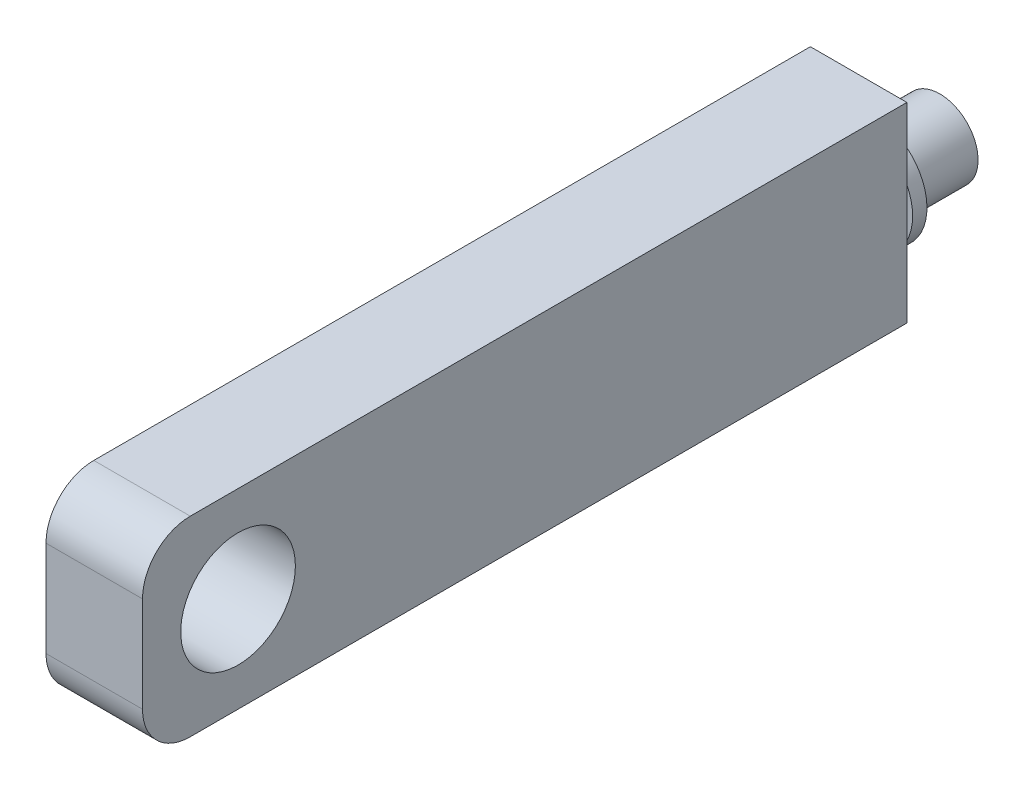
ISO-10303-21;
HEADER;
FILE_DESCRIPTION(('STEP AP214'),'2;1');
FILE_NAME('part.step','',(''),(''),'','','');
FILE_SCHEMA(('AUTOMOTIVE_DESIGN { 1 0 10303 214 1 1 1 1 }'));
ENDSEC;
DATA;
#1=APPLICATION_CONTEXT('core data for automotive mechanical design processes');
#2=APPLICATION_PROTOCOL_DEFINITION('international standard','automotive_design',2000,#1);
#3=PRODUCT_CONTEXT('',#1,'mechanical');
#4=PRODUCT('Part','Part','',(#3));
#5=PRODUCT_RELATED_PRODUCT_CATEGORY('part','',(#4));
#6=PRODUCT_DEFINITION_FORMATION('','',#4);
#7=PRODUCT_DEFINITION_CONTEXT('part definition',#1,'design');
#8=PRODUCT_DEFINITION('design','',#6,#7);
#9=PRODUCT_DEFINITION_SHAPE('','',#8);
#10=(LENGTH_UNIT() NAMED_UNIT(*) SI_UNIT(.MILLI.,.METRE.));
#11=(NAMED_UNIT(*) PLANE_ANGLE_UNIT() SI_UNIT($,.RADIAN.));
#12=(NAMED_UNIT(*) SI_UNIT($,.STERADIAN.) SOLID_ANGLE_UNIT());
#13=UNCERTAINTY_MEASURE_WITH_UNIT(LENGTH_MEASURE(1.E-05),#10,'distance_accuracy_value','');
#14=(GEOMETRIC_REPRESENTATION_CONTEXT(3) GLOBAL_UNCERTAINTY_ASSIGNED_CONTEXT((#13)) GLOBAL_UNIT_ASSIGNED_CONTEXT((#10,
#11,#12)) REPRESENTATION_CONTEXT('',''));
#15=CARTESIAN_POINT('',(0.,0.,0.));
#16=DIRECTION('',(0.,0.,1.));
#17=DIRECTION('',(1.,0.,0.));
#18=AXIS2_PLACEMENT_3D('',#15,#16,#17);
#19=CARTESIAN_POINT('',(0.,20.,-80.));
#20=DIRECTION('',(0.,0.,1.));
#21=DIRECTION('',(1.,0.,0.));
#22=AXIS2_PLACEMENT_3D('',#19,#20,#21);
#23=PLANE('',#22);
#24=CARTESIAN_POINT('',(5.05,10.,-80.));
#25=DIRECTION('',(0.,0.,-1.));
#26=DIRECTION('',(-1.,0.,0.));
#27=AXIS2_PLACEMENT_3D('',#24,#25,#26);
#28=CIRCLE('',#27,5.65);
#29=CARTESIAN_POINT('',(10.1,7.46622810813602,-80.));
#30=VERTEX_POINT('',#29);
#31=CARTESIAN_POINT('',(0.,7.46622810813602,-80.));
#32=VERTEX_POINT('',#31);
#33=EDGE_CURVE('E51',#30,#32,#28,.T.);
#34=ORIENTED_EDGE('',*,*,#33,.F.);
#35=DIRECTION('',(0.,-1.,0.));
#36=VECTOR('',#35,1.);
#37=CARTESIAN_POINT('',(10.1,20.,-80.));
#38=LINE('',#37,#36);
#39=CARTESIAN_POINT('',(10.1,0.,-80.));
#40=VERTEX_POINT('',#39);
#41=EDGE_CURVE('E111',#30,#40,#38,.T.);
#42=ORIENTED_EDGE('',*,*,#41,.T.);
#43=DIRECTION('',(-1.,0.,0.));
#44=VECTOR('',#43,1.);
#45=CARTESIAN_POINT('',(0.,0.,-80.));
#46=LINE('',#45,#44);
#47=CARTESIAN_POINT('',(0.,0.,-80.));
#48=VERTEX_POINT('',#47);
#49=EDGE_CURVE('E151',#40,#48,#46,.T.);
#50=ORIENTED_EDGE('',*,*,#49,.T.);
#51=DIRECTION('',(0.,-1.,0.));
#52=VECTOR('',#51,1.);
#53=CARTESIAN_POINT('',(0.,20.,-80.));
#54=LINE('',#53,#52);
#55=EDGE_CURVE('E56',#32,#48,#54,.T.);
#56=ORIENTED_EDGE('',*,*,#55,.F.);
#57=EDGE_LOOP('',(#34,#42,#50,#56));
#58=FACE_BOUND('',#57,.T.);
#59=ADVANCED_FACE('F35',(#58),#23,.F.);
#60=CARTESIAN_POINT('',(0.,20.,0.));
#61=DIRECTION('',(1.,0.,0.));
#62=DIRECTION('',(0.,0.,-1.));
#63=AXIS2_PLACEMENT_3D('',#60,#61,#62);
#64=PLANE('',#63);
#65=CARTESIAN_POINT('',(0.,10.,-10.));
#66=DIRECTION('',(1.,0.,0.));
#67=DIRECTION('',(0.,0.,-1.));
#68=AXIS2_PLACEMENT_3D('',#65,#66,#67);
#69=CIRCLE('',#68,6.);
#70=CARTESIAN_POINT('',(0.,10.,-16.));
#71=VERTEX_POINT('',#70);
#72=EDGE_CURVE('E143',#71,#71,#69,.F.);
#73=ORIENTED_EDGE('',*,*,#72,.F.);
#74=EDGE_LOOP('',(#73));
#75=FACE_BOUND('',#74,.T.);
#76=DIRECTION('',(0.,0.,1.));
#77=VECTOR('',#76,1.);
#78=CARTESIAN_POINT('',(0.,0.,0.));
#79=LINE('',#78,#77);
#80=CARTESIAN_POINT('',(0.,0.,-5.));
#81=VERTEX_POINT('',#80);
#82=EDGE_CURVE('E146',#48,#81,#79,.T.);
#83=ORIENTED_EDGE('',*,*,#82,.T.);
#84=CARTESIAN_POINT('',(0.,5.,-5.));
#85=DIRECTION('',(1.,0.,0.));
#86=DIRECTION('',(0.,0.,-1.));
#87=AXIS2_PLACEMENT_3D('',#84,#85,#86);
#88=CIRCLE('',#87,5.);
#89=CARTESIAN_POINT('',(0.,5.,0.));
#90=VERTEX_POINT('',#89);
#91=EDGE_CURVE('E44',#81,#90,#88,.F.);
#92=ORIENTED_EDGE('',*,*,#91,.T.);
#93=DIRECTION('',(0.,-1.,0.));
#94=VECTOR('',#93,1.);
#95=CARTESIAN_POINT('',(0.,20.,0.));
#96=LINE('',#95,#94);
#97=CARTESIAN_POINT('',(0.,15.,0.));
#98=VERTEX_POINT('',#97);
#99=EDGE_CURVE('E162',#98,#90,#96,.T.);
#100=ORIENTED_EDGE('',*,*,#99,.F.);
#101=CARTESIAN_POINT('',(0.,15.,-5.));
#102=DIRECTION('',(1.,0.,0.));
#103=DIRECTION('',(0.,0.,-1.));
#104=AXIS2_PLACEMENT_3D('',#101,#102,#103);
#105=CIRCLE('',#104,5.);
#106=CARTESIAN_POINT('',(0.,20.,-5.));
#107=VERTEX_POINT('',#106);
#108=EDGE_CURVE('E176',#98,#107,#105,.F.);
#109=ORIENTED_EDGE('',*,*,#108,.T.);
#110=DIRECTION('',(0.,0.,1.));
#111=VECTOR('',#110,1.);
#112=CARTESIAN_POINT('',(0.,20.,0.));
#113=LINE('',#112,#111);
#114=CARTESIAN_POINT('',(0.,20.,-80.));
#115=VERTEX_POINT('',#114);
#116=EDGE_CURVE('E147',#115,#107,#113,.T.);
#117=ORIENTED_EDGE('',*,*,#116,.F.);
#118=CARTESIAN_POINT('',(0.,12.533771891864,-80.));
#119=VERTEX_POINT('',#118);
#120=EDGE_CURVE('E159',#115,#119,#54,.T.);
#121=ORIENTED_EDGE('',*,*,#120,.T.);
#122=DIRECTION('',(0.,1.,0.));
#123=VECTOR('',#122,1.);
#124=CARTESIAN_POINT('',(0.,20.,-80.));
#125=LINE('',#124,#123);
#126=EDGE_CURVE('E121',#32,#119,#125,.T.);
#127=ORIENTED_EDGE('',*,*,#126,.F.);
#128=ORIENTED_EDGE('',*,*,#55,.T.);
#129=EDGE_LOOP('',(#83,#92,#100,#109,#117,#121,#127,#128));
#130=FACE_BOUND('',#129,.T.);
#131=ADVANCED_FACE('F181',(#75,#130),#64,.F.);
#132=CARTESIAN_POINT('',(0.,20.,0.));
#133=DIRECTION('',(0.,0.,-1.));
#134=DIRECTION('',(-1.,0.,0.));
#135=AXIS2_PLACEMENT_3D('',#132,#133,#134);
#136=PLANE('',#135);
#137=ORIENTED_EDGE('',*,*,#99,.T.);
#138=DIRECTION('',(1.,0.,0.));
#139=VECTOR('',#138,1.);
#140=CARTESIAN_POINT('',(10.1,5.,0.));
#141=LINE('',#140,#139);
#142=CARTESIAN_POINT('',(10.1,5.,0.));
#143=VERTEX_POINT('',#142);
#144=EDGE_CURVE('E167',#90,#143,#141,.T.);
#145=ORIENTED_EDGE('',*,*,#144,.T.);
#146=DIRECTION('',(0.,-1.,0.));
#147=VECTOR('',#146,1.);
#148=CARTESIAN_POINT('',(10.1,20.,0.));
#149=LINE('',#148,#147);
#150=CARTESIAN_POINT('',(10.1,15.,0.));
#151=VERTEX_POINT('',#150);
#152=EDGE_CURVE('E110',#151,#143,#149,.T.);
#153=ORIENTED_EDGE('',*,*,#152,.F.);
#154=DIRECTION('',(1.,0.,0.));
#155=VECTOR('',#154,1.);
#156=CARTESIAN_POINT('',(0.,15.,0.));
#157=LINE('',#156,#155);
#158=EDGE_CURVE('E165',#151,#98,#157,.F.);
#159=ORIENTED_EDGE('',*,*,#158,.T.);
#160=EDGE_LOOP('',(#137,#145,#153,#159));
#161=FACE_BOUND('',#160,.T.);
#162=ADVANCED_FACE('F188',(#161),#136,.F.);
#163=CARTESIAN_POINT('',(10.1,20.,0.));
#164=DIRECTION('',(-1.,0.,0.));
#165=DIRECTION('',(0.,0.,1.));
#166=AXIS2_PLACEMENT_3D('',#163,#164,#165);
#167=PLANE('',#166);
#168=CARTESIAN_POINT('',(10.1,10.,-10.));
#169=DIRECTION('',(1.,0.,0.));
#170=DIRECTION('',(0.,0.,-1.));
#171=AXIS2_PLACEMENT_3D('',#168,#169,#170);
#172=CIRCLE('',#171,6.);
#173=CARTESIAN_POINT('',(10.1,10.,-16.));
#174=VERTEX_POINT('',#173);
#175=EDGE_CURVE('E140',#174,#174,#172,.T.);
#176=ORIENTED_EDGE('',*,*,#175,.F.);
#177=EDGE_LOOP('',(#176));
#178=FACE_BOUND('',#177,.T.);
#179=ORIENTED_EDGE('',*,*,#152,.T.);
#180=CARTESIAN_POINT('',(10.1,5.,-5.));
#181=DIRECTION('',(-1.,0.,0.));
#182=DIRECTION('',(0.,0.,1.));
#183=AXIS2_PLACEMENT_3D('',#180,#181,#182);
#184=CIRCLE('',#183,5.);
#185=CARTESIAN_POINT('',(10.1,0.,-5.));
#186=VERTEX_POINT('',#185);
#187=EDGE_CURVE('E172',#143,#186,#184,.F.);
#188=ORIENTED_EDGE('',*,*,#187,.T.);
#189=DIRECTION('',(0.,0.,-1.));
#190=VECTOR('',#189,1.);
#191=CARTESIAN_POINT('',(10.1,0.,0.));
#192=LINE('',#191,#190);
#193=EDGE_CURVE('E156',#186,#40,#192,.T.);
#194=ORIENTED_EDGE('',*,*,#193,.T.);
#195=ORIENTED_EDGE('',*,*,#41,.F.);
#196=DIRECTION('',(0.,-1.,0.));
#197=VECTOR('',#196,1.);
#198=CARTESIAN_POINT('',(10.1,20.,-80.));
#199=LINE('',#198,#197);
#200=CARTESIAN_POINT('',(10.1,12.533771891864,-80.));
#201=VERTEX_POINT('',#200);
#202=EDGE_CURVE('E114',#201,#30,#199,.T.);
#203=ORIENTED_EDGE('',*,*,#202,.F.);
#204=CARTESIAN_POINT('',(10.1,20.,-80.));
#205=VERTEX_POINT('',#204);
#206=EDGE_CURVE('E100',#205,#201,#38,.T.);
#207=ORIENTED_EDGE('',*,*,#206,.F.);
#208=DIRECTION('',(0.,0.,-1.));
#209=VECTOR('',#208,1.);
#210=CARTESIAN_POINT('',(10.1,20.,0.));
#211=LINE('',#210,#209);
#212=CARTESIAN_POINT('',(10.1,20.,-5.));
#213=VERTEX_POINT('',#212);
#214=EDGE_CURVE('E150',#213,#205,#211,.T.);
#215=ORIENTED_EDGE('',*,*,#214,.F.);
#216=CARTESIAN_POINT('',(10.1,15.,-5.));
#217=DIRECTION('',(-1.,0.,0.));
#218=DIRECTION('',(0.,0.,1.));
#219=AXIS2_PLACEMENT_3D('',#216,#217,#218);
#220=CIRCLE('',#219,5.);
#221=EDGE_CURVE('E170',#213,#151,#220,.F.);
#222=ORIENTED_EDGE('',*,*,#221,.T.);
#223=EDGE_LOOP('',(#179,#188,#194,#195,#203,#207,#215,#222));
#224=FACE_BOUND('',#223,.T.);
#225=ADVANCED_FACE('F117',(#178,#224),#167,.F.);
#226=EDGE_CURVE('E105',#119,#201,#28,.T.);
#227=ORIENTED_EDGE('',*,*,#226,.F.);
#228=ORIENTED_EDGE('',*,*,#120,.F.);
#229=DIRECTION('',(-1.,0.,0.));
#230=VECTOR('',#229,1.);
#231=CARTESIAN_POINT('',(0.,20.,-80.));
#232=LINE('',#231,#230);
#233=EDGE_CURVE('E107',#205,#115,#232,.T.);
#234=ORIENTED_EDGE('',*,*,#233,.F.);
#235=ORIENTED_EDGE('',*,*,#206,.T.);
#236=EDGE_LOOP('',(#227,#228,#234,#235));
#237=FACE_BOUND('',#236,.T.);
#238=ADVANCED_FACE('F102',(#237),#23,.F.);
#239=CARTESIAN_POINT('',(0.,20.,0.));
#240=DIRECTION('',(0.,-1.,0.));
#241=DIRECTION('',(0.,0.,-1.));
#242=AXIS2_PLACEMENT_3D('',#239,#240,#241);
#243=PLANE('',#242);
#244=ORIENTED_EDGE('',*,*,#116,.T.);
#245=DIRECTION('',(1.,0.,0.));
#246=VECTOR('',#245,1.);
#247=CARTESIAN_POINT('',(0.,20.,-5.));
#248=LINE('',#247,#246);
#249=EDGE_CURVE('E11',#107,#213,#248,.T.);
#250=ORIENTED_EDGE('',*,*,#249,.T.);
#251=ORIENTED_EDGE('',*,*,#214,.T.);
#252=ORIENTED_EDGE('',*,*,#233,.T.);
#253=EDGE_LOOP('',(#244,#250,#251,#252));
#254=FACE_BOUND('',#253,.T.);
#255=ADVANCED_FACE('F206',(#254),#243,.F.);
#256=CARTESIAN_POINT('',(0.,0.,0.));
#257=DIRECTION('',(0.,-1.,0.));
#258=DIRECTION('',(0.,0.,-1.));
#259=AXIS2_PLACEMENT_3D('',#256,#257,#258);
#260=PLANE('',#259);
#261=ORIENTED_EDGE('',*,*,#193,.F.);
#262=DIRECTION('',(1.,0.,0.));
#263=VECTOR('',#262,1.);
#264=CARTESIAN_POINT('',(0.,0.,-5.));
#265=LINE('',#264,#263);
#266=EDGE_CURVE('E174',#186,#81,#265,.F.);
#267=ORIENTED_EDGE('',*,*,#266,.T.);
#268=ORIENTED_EDGE('',*,*,#82,.F.);
#269=ORIENTED_EDGE('',*,*,#49,.F.);
#270=EDGE_LOOP('',(#261,#267,#268,#269));
#271=FACE_BOUND('',#270,.T.);
#272=ADVANCED_FACE('F195',(#271),#260,.T.);
#273=CARTESIAN_POINT('',(-0.000999999999999265,10.,-10.));
#274=DIRECTION('',(1.,0.,0.));
#275=DIRECTION('',(0.,0.,-1.));
#276=AXIS2_PLACEMENT_3D('',#273,#274,#275);
#277=CYLINDRICAL_SURFACE('',#276,6.);
#278=ORIENTED_EDGE('',*,*,#175,.T.);
#279=EDGE_LOOP('',(#278));
#280=FACE_BOUND('',#279,.T.);
#281=ORIENTED_EDGE('',*,*,#72,.T.);
#282=EDGE_LOOP('',(#281));
#283=FACE_BOUND('',#282,.T.);
#284=ADVANCED_FACE('F220',(#280,#283),#277,.F.);
#285=CARTESIAN_POINT('',(0.,5.,-5.));
#286=DIRECTION('',(-1.,0.,0.));
#287=DIRECTION('',(0.,0.,1.));
#288=AXIS2_PLACEMENT_3D('',#285,#286,#287);
#289=CYLINDRICAL_SURFACE('',#288,5.);
#290=ORIENTED_EDGE('',*,*,#91,.F.);
#291=ORIENTED_EDGE('',*,*,#266,.F.);
#292=ORIENTED_EDGE('',*,*,#187,.F.);
#293=ORIENTED_EDGE('',*,*,#144,.F.);
#294=EDGE_LOOP('',(#290,#291,#292,#293));
#295=FACE_BOUND('',#294,.T.);
#296=ADVANCED_FACE('F191',(#295),#289,.T.);
#297=CARTESIAN_POINT('',(0.,15.,-5.));
#298=DIRECTION('',(1.,0.,0.));
#299=DIRECTION('',(0.,0.,-1.));
#300=AXIS2_PLACEMENT_3D('',#297,#298,#299);
#301=CYLINDRICAL_SURFACE('',#300,5.);
#302=ORIENTED_EDGE('',*,*,#108,.F.);
#303=ORIENTED_EDGE('',*,*,#158,.F.);
#304=ORIENTED_EDGE('',*,*,#221,.F.);
#305=ORIENTED_EDGE('',*,*,#249,.F.);
#306=EDGE_LOOP('',(#302,#303,#304,#305));
#307=FACE_BOUND('',#306,.T.);
#308=ADVANCED_FACE('F37',(#307),#301,.T.);
#309=CARTESIAN_POINT('',(5.05,10.,-80.));
#310=DIRECTION('',(0.,0.,-1.));
#311=DIRECTION('',(-1.,0.,0.));
#312=AXIS2_PLACEMENT_3D('',#309,#310,#311);
#313=PLANE('',#312);
#314=EDGE_CURVE('E131',#32,#119,#28,.T.);
#315=ORIENTED_EDGE('',*,*,#314,.F.);
#316=ORIENTED_EDGE('',*,*,#126,.T.);
#317=EDGE_LOOP('',(#315,#316));
#318=FACE_BOUND('',#317,.T.);
#319=ADVANCED_FACE('F225',(#318),#313,.F.);
#320=CARTESIAN_POINT('',(5.05,10.,-81.5));
#321=DIRECTION('',(0.,0.,1.));
#322=DIRECTION('',(1.,0.,0.));
#323=AXIS2_PLACEMENT_3D('',#320,#321,#322);
#324=CYLINDRICAL_SURFACE('',#323,5.65);
#325=CARTESIAN_POINT('',(5.05,10.,-81.5));
#326=DIRECTION('',(0.,0.,-1.));
#327=DIRECTION('',(-1.,0.,0.));
#328=AXIS2_PLACEMENT_3D('',#325,#326,#327);
#329=CIRCLE('',#328,5.65);
#330=CARTESIAN_POINT('',(-0.599999999999999,10.,-81.5));
#331=VERTEX_POINT('',#330);
#332=EDGE_CURVE('E122',#331,#331,#329,.T.);
#333=ORIENTED_EDGE('',*,*,#332,.F.);
#334=EDGE_LOOP('',(#333));
#335=FACE_BOUND('',#334,.T.);
#336=ORIENTED_EDGE('',*,*,#226,.T.);
#337=EDGE_CURVE('E124',#201,#30,#28,.T.);
#338=ORIENTED_EDGE('',*,*,#337,.T.);
#339=ORIENTED_EDGE('',*,*,#33,.T.);
#340=ORIENTED_EDGE('',*,*,#314,.T.);
#341=EDGE_LOOP('',(#336,#338,#339,#340));
#342=FACE_BOUND('',#341,.T.);
#343=ADVANCED_FACE('F129',(#335,#342),#324,.T.);
#344=CARTESIAN_POINT('',(5.05,10.,-81.5));
#345=DIRECTION('',(0.,0.,-1.));
#346=DIRECTION('',(-1.,0.,0.));
#347=AXIS2_PLACEMENT_3D('',#344,#345,#346);
#348=PLANE('',#347);
#349=CARTESIAN_POINT('',(5.05,10.,-81.5));
#350=DIRECTION('',(0.,0.,-1.));
#351=DIRECTION('',(-1.,0.,0.));
#352=AXIS2_PLACEMENT_3D('',#349,#350,#351);
#353=CIRCLE('',#352,4.);
#354=CARTESIAN_POINT('',(1.05,10.,-81.5));
#355=VERTEX_POINT('',#354);
#356=EDGE_CURVE('E39',#355,#355,#353,.T.);
#357=ORIENTED_EDGE('',*,*,#356,.F.);
#358=EDGE_LOOP('',(#357));
#359=FACE_BOUND('',#358,.T.);
#360=ORIENTED_EDGE('',*,*,#332,.T.);
#361=EDGE_LOOP('',(#360));
#362=FACE_BOUND('',#361,.T.);
#363=ADVANCED_FACE('F244',(#359,#362),#348,.T.);
#364=ORIENTED_EDGE('',*,*,#337,.F.);
#365=ORIENTED_EDGE('',*,*,#202,.T.);
#366=EDGE_LOOP('',(#364,#365));
#367=FACE_BOUND('',#366,.T.);
#368=ADVANCED_FACE('F125',(#367),#313,.F.);
#369=CARTESIAN_POINT('',(5.05,10.,-88.5));
#370=DIRECTION('',(0.,0.,-1.));
#371=DIRECTION('',(-1.,0.,0.));
#372=AXIS2_PLACEMENT_3D('',#369,#370,#371);
#373=PLANE('',#372);
#374=CARTESIAN_POINT('',(5.05,10.,-88.5));
#375=DIRECTION('',(0.,0.,-1.));
#376=DIRECTION('',(-1.,0.,0.));
#377=AXIS2_PLACEMENT_3D('',#374,#375,#376);
#378=CIRCLE('',#377,4.);
#379=CARTESIAN_POINT('',(1.05,10.,-88.5));
#380=VERTEX_POINT('',#379);
#381=EDGE_CURVE('E137',#380,#380,#378,.T.);
#382=ORIENTED_EDGE('',*,*,#381,.T.);
#383=EDGE_LOOP('',(#382));
#384=FACE_BOUND('',#383,.T.);
#385=ADVANCED_FACE('F237',(#384),#373,.T.);
#386=CARTESIAN_POINT('',(5.05,10.,-88.5));
#387=DIRECTION('',(0.,0.,1.));
#388=DIRECTION('',(1.,0.,0.));
#389=AXIS2_PLACEMENT_3D('',#386,#387,#388);
#390=CYLINDRICAL_SURFACE('',#389,4.);
#391=ORIENTED_EDGE('',*,*,#356,.T.);
#392=EDGE_LOOP('',(#391));
#393=FACE_BOUND('',#392,.T.);
#394=ORIENTED_EDGE('',*,*,#381,.F.);
#395=EDGE_LOOP('',(#394));
#396=FACE_BOUND('',#395,.T.);
#397=ADVANCED_FACE('F234',(#393,#396),#390,.T.);
#398=CLOSED_SHELL('',(#59,#131,#162,#225,#238,#255,#272,#284,#296,#308,#319,#343,#363,#368,#385,#397));
#399=MANIFOLD_SOLID_BREP('B2',#398);
#400=ADVANCED_BREP_SHAPE_REPRESENTATION('',(#18,#399),#14);
#401=SHAPE_DEFINITION_REPRESENTATION(#9,#400);
ENDSEC;
END-ISO-10303-21;
